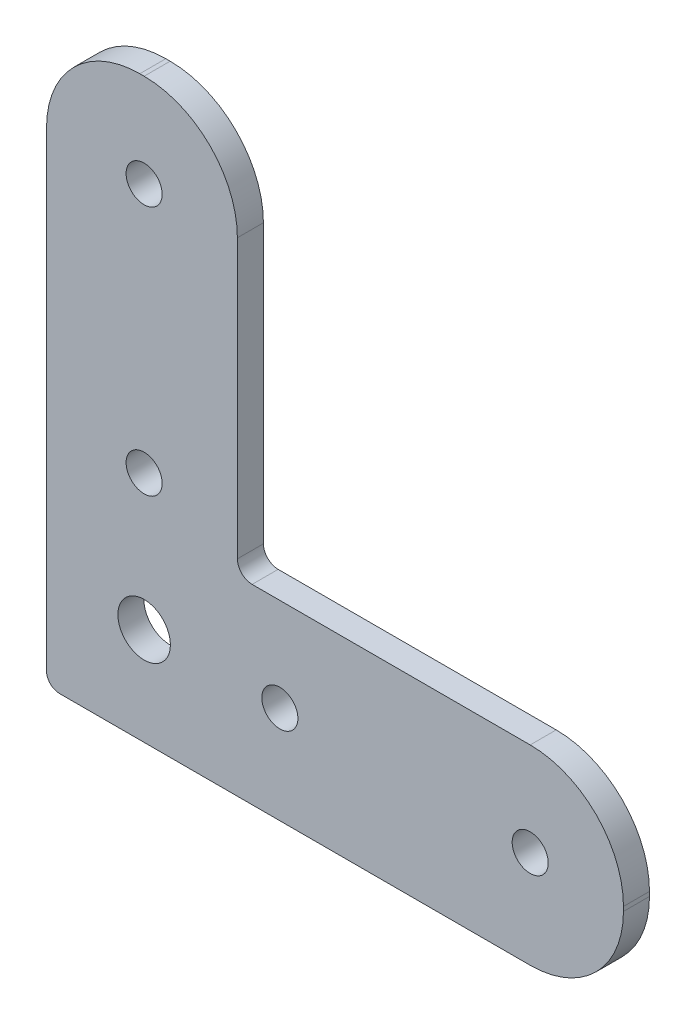
ISO-10303-21;
HEADER;
FILE_DESCRIPTION(('STEP AP214'),'2;1');
FILE_NAME('part.step','',(''),(''),'','','');
FILE_SCHEMA(('AUTOMOTIVE_DESIGN { 1 0 10303 214 1 1 1 1 }'));
ENDSEC;
DATA;
#1=APPLICATION_CONTEXT('core data for automotive mechanical design processes');
#2=APPLICATION_PROTOCOL_DEFINITION('international standard','automotive_design',2000,#1);
#3=PRODUCT_CONTEXT('',#1,'mechanical');
#4=PRODUCT('Part','Part','',(#3));
#5=PRODUCT_RELATED_PRODUCT_CATEGORY('part','',(#4));
#6=PRODUCT_DEFINITION_FORMATION('','',#4);
#7=PRODUCT_DEFINITION_CONTEXT('part definition',#1,'design');
#8=PRODUCT_DEFINITION('design','',#6,#7);
#9=PRODUCT_DEFINITION_SHAPE('','',#8);
#10=(LENGTH_UNIT() NAMED_UNIT(*) SI_UNIT(.MILLI.,.METRE.));
#11=(NAMED_UNIT(*) PLANE_ANGLE_UNIT() SI_UNIT($,.RADIAN.));
#12=(NAMED_UNIT(*) SI_UNIT($,.STERADIAN.) SOLID_ANGLE_UNIT());
#13=UNCERTAINTY_MEASURE_WITH_UNIT(LENGTH_MEASURE(1.E-05),#10,'distance_accuracy_value','');
#14=(GEOMETRIC_REPRESENTATION_CONTEXT(3) GLOBAL_UNCERTAINTY_ASSIGNED_CONTEXT((#13)) GLOBAL_UNIT_ASSIGNED_CONTEXT((#10,
#11,#12)) REPRESENTATION_CONTEXT('',''));
#15=CARTESIAN_POINT('',(0.,0.,0.));
#16=DIRECTION('',(0.,0.,1.));
#17=DIRECTION('',(1.,0.,0.));
#18=AXIS2_PLACEMENT_3D('',#15,#16,#17);
#19=CARTESIAN_POINT('',(0.,44.,3.));
#20=DIRECTION('',(0.,1.,0.));
#21=DIRECTION('',(0.,0.,1.));
#22=AXIS2_PLACEMENT_3D('',#19,#20,#21);
#23=PLANE('',#22);
#24=DIRECTION('',(1.,0.,0.));
#25=VECTOR('',#24,1.);
#26=CARTESIAN_POINT('',(0.,44.,-3.));
#27=LINE('',#26,#25);
#28=CARTESIAN_POINT('',(47.4,44.,-3.));
#29=VERTEX_POINT('',#28);
#30=CARTESIAN_POINT('',(111.5,44.,-3.));
#31=VERTEX_POINT('',#30);
#32=EDGE_CURVE('E216',#29,#31,#27,.T.);
#33=ORIENTED_EDGE('',*,*,#32,.F.);
#34=DIRECTION('',(0.,0.,-1.));
#35=VECTOR('',#34,1.);
#36=CARTESIAN_POINT('',(47.4,44.,3.));
#37=LINE('',#36,#35);
#38=CARTESIAN_POINT('',(47.4,44.,3.));
#39=VERTEX_POINT('',#38);
#40=EDGE_CURVE('E191',#29,#39,#37,.F.);
#41=ORIENTED_EDGE('',*,*,#40,.T.);
#42=DIRECTION('',(1.,0.,0.));
#43=VECTOR('',#42,1.);
#44=CARTESIAN_POINT('',(0.,44.,3.));
#45=LINE('',#44,#43);
#46=CARTESIAN_POINT('',(111.5,44.,3.));
#47=VERTEX_POINT('',#46);
#48=EDGE_CURVE('E210',#39,#47,#45,.T.);
#49=ORIENTED_EDGE('',*,*,#48,.T.);
#50=DIRECTION('',(0.,0.,-1.));
#51=VECTOR('',#50,1.);
#52=CARTESIAN_POINT('',(111.5,44.,3.));
#53=LINE('',#52,#51);
#54=EDGE_CURVE('E176',#47,#31,#53,.T.);
#55=ORIENTED_EDGE('',*,*,#54,.T.);
#56=EDGE_LOOP('',(#33,#41,#49,#55));
#57=FACE_BOUND('',#56,.T.);
#58=ADVANCED_FACE('F43',(#57),#23,.T.);
#59=CARTESIAN_POINT('',(44.,0.,3.));
#60=DIRECTION('',(1.,0.,0.));
#61=DIRECTION('',(0.,1.,0.));
#62=AXIS2_PLACEMENT_3D('',#59,#60,#61);
#63=PLANE('',#62);
#64=DIRECTION('',(0.,-1.,0.));
#65=VECTOR('',#64,1.);
#66=CARTESIAN_POINT('',(44.,0.,3.));
#67=LINE('',#66,#65);
#68=CARTESIAN_POINT('',(44.,111.5,3.));
#69=VERTEX_POINT('',#68);
#70=CARTESIAN_POINT('',(44.,47.4,3.));
#71=VERTEX_POINT('',#70);
#72=EDGE_CURVE('E224',#69,#71,#67,.T.);
#73=ORIENTED_EDGE('',*,*,#72,.T.);
#74=DIRECTION('',(0.,0.,-1.));
#75=VECTOR('',#74,1.);
#76=CARTESIAN_POINT('',(44.,47.4,-3.));
#77=LINE('',#76,#75);
#78=CARTESIAN_POINT('',(44.,47.4,-3.));
#79=VERTEX_POINT('',#78);
#80=EDGE_CURVE('E188',#71,#79,#77,.T.);
#81=ORIENTED_EDGE('',*,*,#80,.T.);
#82=DIRECTION('',(0.,-1.,0.));
#83=VECTOR('',#82,1.);
#84=CARTESIAN_POINT('',(44.,0.,-3.));
#85=LINE('',#84,#83);
#86=CARTESIAN_POINT('',(44.,111.5,-3.));
#87=VERTEX_POINT('',#86);
#88=EDGE_CURVE('E213',#87,#79,#85,.T.);
#89=ORIENTED_EDGE('',*,*,#88,.F.);
#90=DIRECTION('',(0.,0.,-1.));
#91=VECTOR('',#90,1.);
#92=CARTESIAN_POINT('',(44.,111.5,3.));
#93=LINE('',#92,#91);
#94=EDGE_CURVE('E186',#87,#69,#93,.F.);
#95=ORIENTED_EDGE('',*,*,#94,.T.);
#96=EDGE_LOOP('',(#73,#81,#89,#95));
#97=FACE_BOUND('',#96,.T.);
#98=ADVANCED_FACE('F287',(#97),#63,.T.);
#99=CARTESIAN_POINT('',(0.,133.,3.));
#100=DIRECTION('',(0.,-1.,0.));
#101=DIRECTION('',(0.,0.,-1.));
#102=AXIS2_PLACEMENT_3D('',#99,#100,#101);
#103=PLANE('',#102);
#104=DIRECTION('',(-1.,0.,0.));
#105=VECTOR('',#104,1.);
#106=CARTESIAN_POINT('',(0.,133.,-3.));
#107=LINE('',#106,#105);
#108=CARTESIAN_POINT('',(22.5,133.,-3.));
#109=VERTEX_POINT('',#108);
#110=CARTESIAN_POINT('',(21.5,133.,-3.));
#111=VERTEX_POINT('',#110);
#112=EDGE_CURVE('E135',#109,#111,#107,.T.);
#113=ORIENTED_EDGE('',*,*,#112,.T.);
#114=DIRECTION('',(0.,0.,-1.));
#115=VECTOR('',#114,1.);
#116=CARTESIAN_POINT('',(21.5,133.,3.));
#117=LINE('',#116,#115);
#118=CARTESIAN_POINT('',(21.5,133.,3.));
#119=VERTEX_POINT('',#118);
#120=EDGE_CURVE('E143',#111,#119,#117,.F.);
#121=ORIENTED_EDGE('',*,*,#120,.T.);
#122=DIRECTION('',(-1.,0.,0.));
#123=VECTOR('',#122,1.);
#124=CARTESIAN_POINT('',(0.,133.,3.));
#125=LINE('',#124,#123);
#126=CARTESIAN_POINT('',(22.5,133.,3.));
#127=VERTEX_POINT('',#126);
#128=EDGE_CURVE('E221',#127,#119,#125,.T.);
#129=ORIENTED_EDGE('',*,*,#128,.F.);
#130=DIRECTION('',(0.,0.,-1.));
#131=VECTOR('',#130,1.);
#132=CARTESIAN_POINT('',(22.5,133.,-3.));
#133=LINE('',#132,#131);
#134=EDGE_CURVE('E144',#127,#109,#133,.T.);
#135=ORIENTED_EDGE('',*,*,#134,.T.);
#136=EDGE_LOOP('',(#113,#121,#129,#135));
#137=FACE_BOUND('',#136,.T.);
#138=ADVANCED_FACE('F294',(#137),#103,.F.);
#139=CARTESIAN_POINT('',(0.,0.,3.));
#140=DIRECTION('',(-1.,0.,0.));
#141=DIRECTION('',(0.,0.,1.));
#142=AXIS2_PLACEMENT_3D('',#139,#140,#141);
#143=PLANE('',#142);
#144=DIRECTION('',(0.,1.,0.));
#145=VECTOR('',#144,1.);
#146=CARTESIAN_POINT('',(0.,0.,-3.));
#147=LINE('',#146,#145);
#148=CARTESIAN_POINT('',(0.,3.,-3.));
#149=VERTEX_POINT('',#148);
#150=CARTESIAN_POINT('',(0.,111.5,-3.));
#151=VERTEX_POINT('',#150);
#152=EDGE_CURVE('E127',#149,#151,#147,.T.);
#153=ORIENTED_EDGE('',*,*,#152,.F.);
#154=DIRECTION('',(0.,0.,-1.));
#155=VECTOR('',#154,1.);
#156=CARTESIAN_POINT('',(0.,3.,3.));
#157=LINE('',#156,#155);
#158=CARTESIAN_POINT('',(0.,3.,3.));
#159=VERTEX_POINT('',#158);
#160=EDGE_CURVE('E51',#149,#159,#157,.F.);
#161=ORIENTED_EDGE('',*,*,#160,.T.);
#162=DIRECTION('',(0.,1.,0.));
#163=VECTOR('',#162,1.);
#164=CARTESIAN_POINT('',(0.,0.,3.));
#165=LINE('',#164,#163);
#166=CARTESIAN_POINT('',(0.,111.5,3.));
#167=VERTEX_POINT('',#166);
#168=EDGE_CURVE('E148',#159,#167,#165,.T.);
#169=ORIENTED_EDGE('',*,*,#168,.T.);
#170=DIRECTION('',(0.,0.,-1.));
#171=VECTOR('',#170,1.);
#172=CARTESIAN_POINT('',(0.,111.5,-3.));
#173=LINE('',#172,#171);
#174=EDGE_CURVE('E142',#167,#151,#173,.T.);
#175=ORIENTED_EDGE('',*,*,#174,.T.);
#176=EDGE_LOOP('',(#153,#161,#169,#175));
#177=FACE_BOUND('',#176,.T.);
#178=ADVANCED_FACE('F147',(#177),#143,.T.);
#179=CARTESIAN_POINT('',(0.,0.,3.));
#180=DIRECTION('',(0.,-1.,0.));
#181=DIRECTION('',(1.,0.,0.));
#182=AXIS2_PLACEMENT_3D('',#179,#180,#181);
#183=PLANE('',#182);
#184=DIRECTION('',(-1.,0.,0.));
#185=VECTOR('',#184,1.);
#186=CARTESIAN_POINT('',(0.,0.,3.));
#187=LINE('',#186,#185);
#188=CARTESIAN_POINT('',(111.5,0.,3.));
#189=VERTEX_POINT('',#188);
#190=CARTESIAN_POINT('',(3.,0.,3.));
#191=VERTEX_POINT('',#190);
#192=EDGE_CURVE('E156',#189,#191,#187,.T.);
#193=ORIENTED_EDGE('',*,*,#192,.T.);
#194=DIRECTION('',(0.,0.,-1.));
#195=VECTOR('',#194,1.);
#196=CARTESIAN_POINT('',(3.,0.,3.));
#197=LINE('',#196,#195);
#198=CARTESIAN_POINT('',(3.,0.,-3.));
#199=VERTEX_POINT('',#198);
#200=EDGE_CURVE('E197',#191,#199,#197,.T.);
#201=ORIENTED_EDGE('',*,*,#200,.T.);
#202=DIRECTION('',(-1.,0.,0.));
#203=VECTOR('',#202,1.);
#204=CARTESIAN_POINT('',(0.,0.,-3.));
#205=LINE('',#204,#203);
#206=CARTESIAN_POINT('',(111.5,0.,-3.));
#207=VERTEX_POINT('',#206);
#208=EDGE_CURVE('E134',#207,#199,#205,.T.);
#209=ORIENTED_EDGE('',*,*,#208,.F.);
#210=DIRECTION('',(0.,0.,-1.));
#211=VECTOR('',#210,1.);
#212=CARTESIAN_POINT('',(111.5,0.,3.));
#213=LINE('',#212,#211);
#214=EDGE_CURVE('E184',#207,#189,#213,.F.);
#215=ORIENTED_EDGE('',*,*,#214,.T.);
#216=EDGE_LOOP('',(#193,#201,#209,#215));
#217=FACE_BOUND('',#216,.T.);
#218=ADVANCED_FACE('F204',(#217),#183,.T.);
#219=CARTESIAN_POINT('',(133.,0.,3.));
#220=DIRECTION('',(1.,0.,0.));
#221=DIRECTION('',(0.,0.,-1.));
#222=AXIS2_PLACEMENT_3D('',#219,#220,#221);
#223=PLANE('',#222);
#224=DIRECTION('',(0.,-1.,0.));
#225=VECTOR('',#224,1.);
#226=CARTESIAN_POINT('',(133.,0.,-3.));
#227=LINE('',#226,#225);
#228=CARTESIAN_POINT('',(133.,22.5,-3.));
#229=VERTEX_POINT('',#228);
#230=CARTESIAN_POINT('',(133.,21.5,-3.));
#231=VERTEX_POINT('',#230);
#232=EDGE_CURVE('E159',#229,#231,#227,.T.);
#233=ORIENTED_EDGE('',*,*,#232,.F.);
#234=DIRECTION('',(0.,0.,-1.));
#235=VECTOR('',#234,1.);
#236=CARTESIAN_POINT('',(133.,22.5,3.));
#237=LINE('',#236,#235);
#238=CARTESIAN_POINT('',(133.,22.5,3.));
#239=VERTEX_POINT('',#238);
#240=EDGE_CURVE('E182',#229,#239,#237,.F.);
#241=ORIENTED_EDGE('',*,*,#240,.T.);
#242=DIRECTION('',(0.,-1.,0.));
#243=VECTOR('',#242,1.);
#244=CARTESIAN_POINT('',(133.,0.,3.));
#245=LINE('',#244,#243);
#246=CARTESIAN_POINT('',(133.,21.5,3.));
#247=VERTEX_POINT('',#246);
#248=EDGE_CURVE('E151',#239,#247,#245,.T.);
#249=ORIENTED_EDGE('',*,*,#248,.T.);
#250=DIRECTION('',(0.,0.,-1.));
#251=VECTOR('',#250,1.);
#252=CARTESIAN_POINT('',(133.,21.5,3.));
#253=LINE('',#252,#251);
#254=EDGE_CURVE('E179',#247,#231,#253,.T.);
#255=ORIENTED_EDGE('',*,*,#254,.T.);
#256=EDGE_LOOP('',(#233,#241,#249,#255));
#257=FACE_BOUND('',#256,.T.);
#258=ADVANCED_FACE('F263',(#257),#223,.T.);
#259=CARTESIAN_POINT('',(0.,0.,3.));
#260=DIRECTION('',(0.,0.,1.));
#261=DIRECTION('',(1.,0.,0.));
#262=AXIS2_PLACEMENT_3D('',#259,#260,#261);
#263=PLANE('',#262);
#264=CARTESIAN_POINT('',(22.5,22.5,3.));
#265=DIRECTION('',(0.,0.,1.));
#266=DIRECTION('',(1.,0.,0.));
#267=AXIS2_PLACEMENT_3D('',#264,#265,#266);
#268=CIRCLE('',#267,6.05);
#269=CARTESIAN_POINT('',(28.55,22.5,3.));
#270=VERTEX_POINT('',#269);
#271=EDGE_CURVE('E254',#270,#270,#268,.T.);
#272=ORIENTED_EDGE('',*,*,#271,.F.);
#273=EDGE_LOOP('',(#272));
#274=FACE_BOUND('',#273,.T.);
#275=CARTESIAN_POINT('',(22.5,111.5,3.));
#276=DIRECTION('',(0.,0.,1.));
#277=DIRECTION('',(1.,0.,0.));
#278=AXIS2_PLACEMENT_3D('',#275,#276,#277);
#279=CIRCLE('',#278,4.15924999999999);
#280=CARTESIAN_POINT('',(26.65925,111.5,3.));
#281=VERTEX_POINT('',#280);
#282=EDGE_CURVE('E248',#281,#281,#279,.T.);
#283=ORIENTED_EDGE('',*,*,#282,.F.);
#284=EDGE_LOOP('',(#283));
#285=FACE_BOUND('',#284,.T.);
#286=CARTESIAN_POINT('',(22.5,53.7884,3.));
#287=DIRECTION('',(0.,0.,1.));
#288=DIRECTION('',(1.,0.,0.));
#289=AXIS2_PLACEMENT_3D('',#286,#287,#288);
#290=CIRCLE('',#289,4.15924999999999);
#291=CARTESIAN_POINT('',(26.65925,53.7884,3.));
#292=VERTEX_POINT('',#291);
#293=EDGE_CURVE('E242',#292,#292,#290,.T.);
#294=ORIENTED_EDGE('',*,*,#293,.F.);
#295=EDGE_LOOP('',(#294));
#296=FACE_BOUND('',#295,.T.);
#297=CARTESIAN_POINT('',(53.7884,22.5,3.));
#298=DIRECTION('',(0.,0.,1.));
#299=DIRECTION('',(1.,0.,0.));
#300=AXIS2_PLACEMENT_3D('',#297,#298,#299);
#301=CIRCLE('',#300,4.15924999999999);
#302=CARTESIAN_POINT('',(57.94765,22.5,3.));
#303=VERTEX_POINT('',#302);
#304=EDGE_CURVE('E236',#303,#303,#301,.T.);
#305=ORIENTED_EDGE('',*,*,#304,.F.);
#306=EDGE_LOOP('',(#305));
#307=FACE_BOUND('',#306,.T.);
#308=CARTESIAN_POINT('',(111.5,22.5,3.));
#309=DIRECTION('',(0.,0.,1.));
#310=DIRECTION('',(1.,0.,0.));
#311=AXIS2_PLACEMENT_3D('',#308,#309,#310);
#312=CIRCLE('',#311,4.15924999999999);
#313=CARTESIAN_POINT('',(115.65925,22.5,3.));
#314=VERTEX_POINT('',#313);
#315=EDGE_CURVE('E230',#314,#314,#312,.T.);
#316=ORIENTED_EDGE('',*,*,#315,.F.);
#317=EDGE_LOOP('',(#316));
#318=FACE_BOUND('',#317,.T.);
#319=ORIENTED_EDGE('',*,*,#168,.F.);
#320=CARTESIAN_POINT('',(3.,3.,3.));
#321=DIRECTION('',(0.,0.,1.));
#322=DIRECTION('',(1.,0.,0.));
#323=AXIS2_PLACEMENT_3D('',#320,#321,#322);
#324=CIRCLE('',#323,3.);
#325=EDGE_CURVE('E11',#159,#191,#324,.T.);
#326=ORIENTED_EDGE('',*,*,#325,.T.);
#327=ORIENTED_EDGE('',*,*,#192,.F.);
#328=CARTESIAN_POINT('',(111.5,21.5,3.));
#329=DIRECTION('',(0.,0.,1.));
#330=DIRECTION('',(1.,0.,0.));
#331=AXIS2_PLACEMENT_3D('',#328,#329,#330);
#332=CIRCLE('',#331,21.5);
#333=EDGE_CURVE('E169',#189,#247,#332,.T.);
#334=ORIENTED_EDGE('',*,*,#333,.T.);
#335=ORIENTED_EDGE('',*,*,#248,.F.);
#336=CARTESIAN_POINT('',(111.5,22.5,3.));
#337=DIRECTION('',(0.,0.,1.));
#338=DIRECTION('',(1.,0.,0.));
#339=AXIS2_PLACEMENT_3D('',#336,#337,#338);
#340=CIRCLE('',#339,21.5);
#341=EDGE_CURVE('E171',#239,#47,#340,.T.);
#342=ORIENTED_EDGE('',*,*,#341,.T.);
#343=ORIENTED_EDGE('',*,*,#48,.F.);
#344=CARTESIAN_POINT('',(47.4,47.4,3.));
#345=DIRECTION('',(0.,0.,1.));
#346=DIRECTION('',(1.,0.,0.));
#347=AXIS2_PLACEMENT_3D('',#344,#345,#346);
#348=CIRCLE('',#347,3.4);
#349=EDGE_CURVE('E195',#39,#71,#348,.F.);
#350=ORIENTED_EDGE('',*,*,#349,.T.);
#351=ORIENTED_EDGE('',*,*,#72,.F.);
#352=CARTESIAN_POINT('',(22.5,111.5,3.));
#353=DIRECTION('',(0.,0.,1.));
#354=DIRECTION('',(1.,0.,0.));
#355=AXIS2_PLACEMENT_3D('',#352,#353,#354);
#356=CIRCLE('',#355,21.5);
#357=EDGE_CURVE('E167',#69,#127,#356,.T.);
#358=ORIENTED_EDGE('',*,*,#357,.T.);
#359=ORIENTED_EDGE('',*,*,#128,.T.);
#360=CARTESIAN_POINT('',(21.5,111.5,3.));
#361=DIRECTION('',(0.,0.,1.));
#362=DIRECTION('',(1.,0.,0.));
#363=AXIS2_PLACEMENT_3D('',#360,#361,#362);
#364=CIRCLE('',#363,21.5);
#365=EDGE_CURVE('E174',#119,#167,#364,.T.);
#366=ORIENTED_EDGE('',*,*,#365,.T.);
#367=EDGE_LOOP('',(#319,#326,#327,#334,#335,#342,#343,#350,#351,#358,#359,#366));
#368=FACE_BOUND('',#367,.T.);
#369=ADVANCED_FACE('F260',(#274,#285,#296,#307,#318,#368),#263,.T.);
#370=CARTESIAN_POINT('',(0.,0.,-3.));
#371=DIRECTION('',(0.,0.,1.));
#372=DIRECTION('',(1.,0.,0.));
#373=AXIS2_PLACEMENT_3D('',#370,#371,#372);
#374=PLANE('',#373);
#375=CARTESIAN_POINT('',(22.5,22.5,-3.));
#376=DIRECTION('',(0.,0.,1.));
#377=DIRECTION('',(1.,0.,0.));
#378=AXIS2_PLACEMENT_3D('',#375,#376,#377);
#379=CIRCLE('',#378,6.05);
#380=CARTESIAN_POINT('',(28.55,22.5,-3.));
#381=VERTEX_POINT('',#380);
#382=EDGE_CURVE('E251',#381,#381,#379,.T.);
#383=ORIENTED_EDGE('',*,*,#382,.T.);
#384=EDGE_LOOP('',(#383));
#385=FACE_BOUND('',#384,.T.);
#386=CARTESIAN_POINT('',(22.5,111.5,-3.));
#387=DIRECTION('',(0.,0.,1.));
#388=DIRECTION('',(1.,0.,0.));
#389=AXIS2_PLACEMENT_3D('',#386,#387,#388);
#390=CIRCLE('',#389,4.15925);
#391=CARTESIAN_POINT('',(26.65925,111.5,-3.));
#392=VERTEX_POINT('',#391);
#393=EDGE_CURVE('E245',#392,#392,#390,.T.);
#394=ORIENTED_EDGE('',*,*,#393,.T.);
#395=EDGE_LOOP('',(#394));
#396=FACE_BOUND('',#395,.T.);
#397=CARTESIAN_POINT('',(22.5,53.7884,-3.));
#398=DIRECTION('',(0.,0.,1.));
#399=DIRECTION('',(1.,0.,0.));
#400=AXIS2_PLACEMENT_3D('',#397,#398,#399);
#401=CIRCLE('',#400,4.15925);
#402=CARTESIAN_POINT('',(26.65925,53.7884,-3.));
#403=VERTEX_POINT('',#402);
#404=EDGE_CURVE('E239',#403,#403,#401,.T.);
#405=ORIENTED_EDGE('',*,*,#404,.T.);
#406=EDGE_LOOP('',(#405));
#407=FACE_BOUND('',#406,.T.);
#408=CARTESIAN_POINT('',(53.7884,22.5,-3.));
#409=DIRECTION('',(0.,0.,1.));
#410=DIRECTION('',(1.,0.,0.));
#411=AXIS2_PLACEMENT_3D('',#408,#409,#410);
#412=CIRCLE('',#411,4.15925);
#413=CARTESIAN_POINT('',(57.94765,22.5,-3.));
#414=VERTEX_POINT('',#413);
#415=EDGE_CURVE('E233',#414,#414,#412,.T.);
#416=ORIENTED_EDGE('',*,*,#415,.T.);
#417=EDGE_LOOP('',(#416));
#418=FACE_BOUND('',#417,.T.);
#419=CARTESIAN_POINT('',(111.5,22.5,-3.));
#420=DIRECTION('',(0.,0.,1.));
#421=DIRECTION('',(1.,0.,0.));
#422=AXIS2_PLACEMENT_3D('',#419,#420,#421);
#423=CIRCLE('',#422,4.15925);
#424=CARTESIAN_POINT('',(115.65925,22.5,-3.));
#425=VERTEX_POINT('',#424);
#426=EDGE_CURVE('E217',#425,#425,#423,.T.);
#427=ORIENTED_EDGE('',*,*,#426,.T.);
#428=EDGE_LOOP('',(#427));
#429=FACE_BOUND('',#428,.T.);
#430=ORIENTED_EDGE('',*,*,#208,.T.);
#431=CARTESIAN_POINT('',(3.,3.,-3.));
#432=DIRECTION('',(0.,0.,1.));
#433=DIRECTION('',(1.,0.,0.));
#434=AXIS2_PLACEMENT_3D('',#431,#432,#433);
#435=CIRCLE('',#434,3.);
#436=EDGE_CURVE('E65',#199,#149,#435,.F.);
#437=ORIENTED_EDGE('',*,*,#436,.T.);
#438=ORIENTED_EDGE('',*,*,#152,.T.);
#439=CARTESIAN_POINT('',(21.5,111.5,-3.));
#440=DIRECTION('',(0.,0.,1.));
#441=DIRECTION('',(1.,0.,0.));
#442=AXIS2_PLACEMENT_3D('',#439,#440,#441);
#443=CIRCLE('',#442,21.5);
#444=EDGE_CURVE('E131',#151,#111,#443,.F.);
#445=ORIENTED_EDGE('',*,*,#444,.T.);
#446=ORIENTED_EDGE('',*,*,#112,.F.);
#447=CARTESIAN_POINT('',(22.5,111.5,-3.));
#448=DIRECTION('',(0.,0.,1.));
#449=DIRECTION('',(1.,0.,0.));
#450=AXIS2_PLACEMENT_3D('',#447,#448,#449);
#451=CIRCLE('',#450,21.5);
#452=EDGE_CURVE('E150',#109,#87,#451,.F.);
#453=ORIENTED_EDGE('',*,*,#452,.T.);
#454=ORIENTED_EDGE('',*,*,#88,.T.);
#455=CARTESIAN_POINT('',(47.4,47.4,-3.));
#456=DIRECTION('',(0.,0.,1.));
#457=DIRECTION('',(1.,0.,0.));
#458=AXIS2_PLACEMENT_3D('',#455,#456,#457);
#459=CIRCLE('',#458,3.4);
#460=EDGE_CURVE('E193',#79,#29,#459,.T.);
#461=ORIENTED_EDGE('',*,*,#460,.T.);
#462=ORIENTED_EDGE('',*,*,#32,.T.);
#463=CARTESIAN_POINT('',(111.5,22.5,-3.));
#464=DIRECTION('',(0.,0.,1.));
#465=DIRECTION('',(1.,0.,0.));
#466=AXIS2_PLACEMENT_3D('',#463,#464,#465);
#467=CIRCLE('',#466,21.5);
#468=EDGE_CURVE('E145',#31,#229,#467,.F.);
#469=ORIENTED_EDGE('',*,*,#468,.T.);
#470=ORIENTED_EDGE('',*,*,#232,.T.);
#471=CARTESIAN_POINT('',(111.5,21.5,-3.));
#472=DIRECTION('',(0.,0.,1.));
#473=DIRECTION('',(1.,0.,0.));
#474=AXIS2_PLACEMENT_3D('',#471,#472,#473);
#475=CIRCLE('',#474,21.5);
#476=EDGE_CURVE('E153',#231,#207,#475,.F.);
#477=ORIENTED_EDGE('',*,*,#476,.T.);
#478=EDGE_LOOP('',(#430,#437,#438,#445,#446,#453,#454,#461,#462,#469,#470,#477));
#479=FACE_BOUND('',#478,.T.);
#480=ADVANCED_FACE('F129',(#385,#396,#407,#418,#429,#479),#374,.F.);
#481=CARTESIAN_POINT('',(21.5,111.5,3.));
#482=DIRECTION('',(0.,0.,1.));
#483=DIRECTION('',(1.,0.,0.));
#484=AXIS2_PLACEMENT_3D('',#481,#482,#483);
#485=CYLINDRICAL_SURFACE('',#484,21.5);
#486=ORIENTED_EDGE('',*,*,#365,.F.);
#487=ORIENTED_EDGE('',*,*,#120,.F.);
#488=ORIENTED_EDGE('',*,*,#444,.F.);
#489=ORIENTED_EDGE('',*,*,#174,.F.);
#490=EDGE_LOOP('',(#486,#487,#488,#489));
#491=FACE_BOUND('',#490,.T.);
#492=ADVANCED_FACE('F141',(#491),#485,.T.);
#493=CARTESIAN_POINT('',(111.5,22.5,3.));
#494=DIRECTION('',(0.,0.,-1.));
#495=DIRECTION('',(-1.,0.,0.));
#496=AXIS2_PLACEMENT_3D('',#493,#494,#495);
#497=CYLINDRICAL_SURFACE('',#496,21.5);
#498=ORIENTED_EDGE('',*,*,#341,.F.);
#499=ORIENTED_EDGE('',*,*,#240,.F.);
#500=ORIENTED_EDGE('',*,*,#468,.F.);
#501=ORIENTED_EDGE('',*,*,#54,.F.);
#502=EDGE_LOOP('',(#498,#499,#500,#501));
#503=FACE_BOUND('',#502,.T.);
#504=ADVANCED_FACE('F302',(#503),#497,.T.);
#505=CARTESIAN_POINT('',(111.5,21.5,3.));
#506=DIRECTION('',(0.,0.,-1.));
#507=DIRECTION('',(-1.,0.,0.));
#508=AXIS2_PLACEMENT_3D('',#505,#506,#507);
#509=CYLINDRICAL_SURFACE('',#508,21.5);
#510=ORIENTED_EDGE('',*,*,#333,.F.);
#511=ORIENTED_EDGE('',*,*,#214,.F.);
#512=ORIENTED_EDGE('',*,*,#476,.F.);
#513=ORIENTED_EDGE('',*,*,#254,.F.);
#514=EDGE_LOOP('',(#510,#511,#512,#513));
#515=FACE_BOUND('',#514,.T.);
#516=ADVANCED_FACE('F305',(#515),#509,.T.);
#517=CARTESIAN_POINT('',(22.5,111.5,3.));
#518=DIRECTION('',(0.,0.,1.));
#519=DIRECTION('',(1.,0.,0.));
#520=AXIS2_PLACEMENT_3D('',#517,#518,#519);
#521=CYLINDRICAL_SURFACE('',#520,21.5);
#522=ORIENTED_EDGE('',*,*,#357,.F.);
#523=ORIENTED_EDGE('',*,*,#94,.F.);
#524=ORIENTED_EDGE('',*,*,#452,.F.);
#525=ORIENTED_EDGE('',*,*,#134,.F.);
#526=EDGE_LOOP('',(#522,#523,#524,#525));
#527=FACE_BOUND('',#526,.T.);
#528=ADVANCED_FACE('F284',(#527),#521,.T.);
#529=CARTESIAN_POINT('',(47.4,47.4,3.));
#530=DIRECTION('',(0.,0.,1.));
#531=DIRECTION('',(1.,0.,0.));
#532=AXIS2_PLACEMENT_3D('',#529,#530,#531);
#533=CYLINDRICAL_SURFACE('',#532,3.4);
#534=ORIENTED_EDGE('',*,*,#349,.F.);
#535=ORIENTED_EDGE('',*,*,#40,.F.);
#536=ORIENTED_EDGE('',*,*,#460,.F.);
#537=ORIENTED_EDGE('',*,*,#80,.F.);
#538=EDGE_LOOP('',(#534,#535,#536,#537));
#539=FACE_BOUND('',#538,.T.);
#540=ADVANCED_FACE('F275',(#539),#533,.F.);
#541=CARTESIAN_POINT('',(3.,3.,3.));
#542=DIRECTION('',(0.,0.,-1.));
#543=DIRECTION('',(-1.,0.,0.));
#544=AXIS2_PLACEMENT_3D('',#541,#542,#543);
#545=CYLINDRICAL_SURFACE('',#544,3.);
#546=ORIENTED_EDGE('',*,*,#325,.F.);
#547=ORIENTED_EDGE('',*,*,#160,.F.);
#548=ORIENTED_EDGE('',*,*,#436,.F.);
#549=ORIENTED_EDGE('',*,*,#200,.F.);
#550=EDGE_LOOP('',(#546,#547,#548,#549));
#551=FACE_BOUND('',#550,.T.);
#552=ADVANCED_FACE('F45',(#551),#545,.T.);
#553=CARTESIAN_POINT('',(111.5,22.5,3.));
#554=DIRECTION('',(0.,0.,1.));
#555=DIRECTION('',(1.,0.,0.));
#556=AXIS2_PLACEMENT_3D('',#553,#554,#555);
#557=CYLINDRICAL_SURFACE('',#556,4.15925);
#558=ORIENTED_EDGE('',*,*,#426,.F.);
#559=EDGE_LOOP('',(#558));
#560=FACE_BOUND('',#559,.T.);
#561=ORIENTED_EDGE('',*,*,#315,.T.);
#562=EDGE_LOOP('',(#561));
#563=FACE_BOUND('',#562,.T.);
#564=ADVANCED_FACE('F274',(#560,#563),#557,.F.);
#565=CARTESIAN_POINT('',(53.7884,22.5,3.));
#566=DIRECTION('',(0.,0.,1.));
#567=DIRECTION('',(1.,0.,0.));
#568=AXIS2_PLACEMENT_3D('',#565,#566,#567);
#569=CYLINDRICAL_SURFACE('',#568,4.15924999999999);
#570=ORIENTED_EDGE('',*,*,#415,.F.);
#571=EDGE_LOOP('',(#570));
#572=FACE_BOUND('',#571,.T.);
#573=ORIENTED_EDGE('',*,*,#304,.T.);
#574=EDGE_LOOP('',(#573));
#575=FACE_BOUND('',#574,.T.);
#576=ADVANCED_FACE('F280',(#572,#575),#569,.F.);
#577=CARTESIAN_POINT('',(22.5,53.7884,3.));
#578=DIRECTION('',(0.,0.,1.));
#579=DIRECTION('',(1.,0.,0.));
#580=AXIS2_PLACEMENT_3D('',#577,#578,#579);
#581=CYLINDRICAL_SURFACE('',#580,4.15924999999999);
#582=ORIENTED_EDGE('',*,*,#404,.F.);
#583=EDGE_LOOP('',(#582));
#584=FACE_BOUND('',#583,.T.);
#585=ORIENTED_EDGE('',*,*,#293,.T.);
#586=EDGE_LOOP('',(#585));
#587=FACE_BOUND('',#586,.T.);
#588=ADVANCED_FACE('F428',(#584,#587),#581,.F.);
#589=CARTESIAN_POINT('',(22.5,111.5,3.));
#590=DIRECTION('',(0.,0.,1.));
#591=DIRECTION('',(1.,0.,0.));
#592=AXIS2_PLACEMENT_3D('',#589,#590,#591);
#593=CYLINDRICAL_SURFACE('',#592,4.15924999999999);
#594=ORIENTED_EDGE('',*,*,#393,.F.);
#595=EDGE_LOOP('',(#594));
#596=FACE_BOUND('',#595,.T.);
#597=ORIENTED_EDGE('',*,*,#282,.T.);
#598=EDGE_LOOP('',(#597));
#599=FACE_BOUND('',#598,.T.);
#600=ADVANCED_FACE('F438',(#596,#599),#593,.F.);
#601=CARTESIAN_POINT('',(22.5,22.5,3.));
#602=DIRECTION('',(0.,0.,1.));
#603=DIRECTION('',(1.,0.,0.));
#604=AXIS2_PLACEMENT_3D('',#601,#602,#603);
#605=CYLINDRICAL_SURFACE('',#604,6.05);
#606=ORIENTED_EDGE('',*,*,#382,.F.);
#607=EDGE_LOOP('',(#606));
#608=FACE_BOUND('',#607,.T.);
#609=ORIENTED_EDGE('',*,*,#271,.T.);
#610=EDGE_LOOP('',(#609));
#611=FACE_BOUND('',#610,.T.);
#612=ADVANCED_FACE('F258',(#608,#611),#605,.F.);
#613=CLOSED_SHELL('',(#58,#98,#138,#178,#218,#258,#369,#480,#492,#504,#516,#528,#540,#552,#564,
#576,#588,#600,#612));
#614=MANIFOLD_SOLID_BREP('B2',#613);
#615=ADVANCED_BREP_SHAPE_REPRESENTATION('',(#18,#614),#14);
#616=SHAPE_DEFINITION_REPRESENTATION(#9,#615);
ENDSEC;
END-ISO-10303-21;
